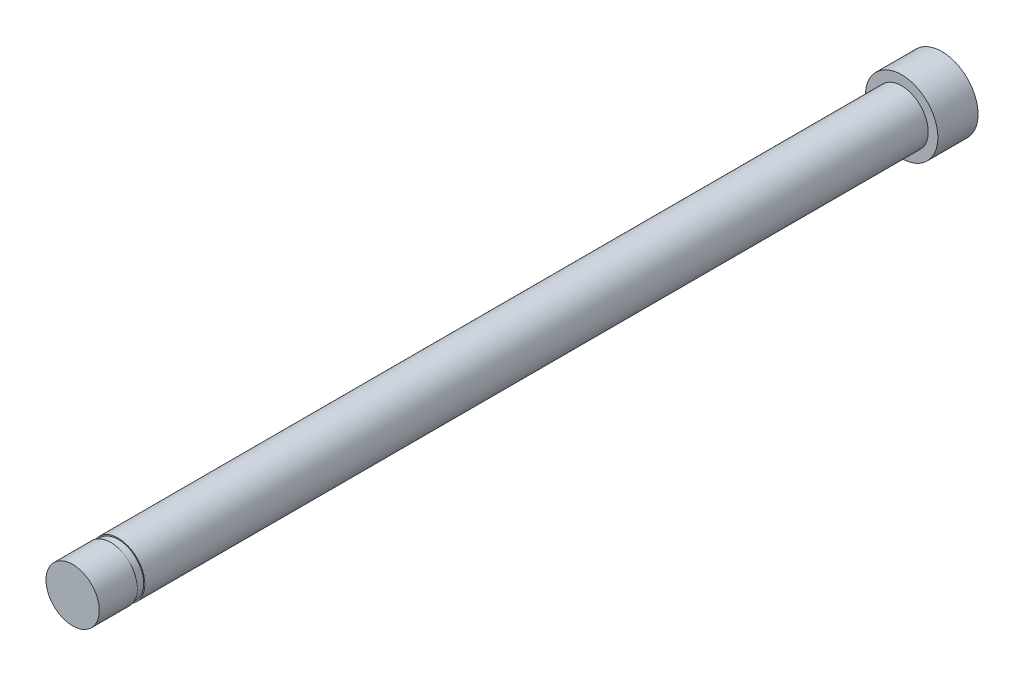
ISO-10303-21;
HEADER;
FILE_DESCRIPTION(('STEP AP214'),'2;1');
FILE_NAME('part.step','',(''),(''),'','','');
FILE_SCHEMA(('AUTOMOTIVE_DESIGN { 1 0 10303 214 1 1 1 1 }'));
ENDSEC;
DATA;
#1=APPLICATION_CONTEXT('core data for automotive mechanical design processes');
#2=APPLICATION_PROTOCOL_DEFINITION('international standard','automotive_design',2000,#1);
#3=PRODUCT_CONTEXT('',#1,'mechanical');
#4=PRODUCT('Part','Part','',(#3));
#5=PRODUCT_RELATED_PRODUCT_CATEGORY('part','',(#4));
#6=PRODUCT_DEFINITION_FORMATION('','',#4);
#7=PRODUCT_DEFINITION_CONTEXT('part definition',#1,'design');
#8=PRODUCT_DEFINITION('design','',#6,#7);
#9=PRODUCT_DEFINITION_SHAPE('','',#8);
#10=(LENGTH_UNIT() NAMED_UNIT(*) SI_UNIT(.MILLI.,.METRE.));
#11=(NAMED_UNIT(*) PLANE_ANGLE_UNIT() SI_UNIT($,.RADIAN.));
#12=(NAMED_UNIT(*) SI_UNIT($,.STERADIAN.) SOLID_ANGLE_UNIT());
#13=UNCERTAINTY_MEASURE_WITH_UNIT(LENGTH_MEASURE(1.E-05),#10,'distance_accuracy_value','');
#14=(GEOMETRIC_REPRESENTATION_CONTEXT(3) GLOBAL_UNCERTAINTY_ASSIGNED_CONTEXT((#13)) GLOBAL_UNIT_ASSIGNED_CONTEXT((#10,
#11,#12)) REPRESENTATION_CONTEXT('',''));
#15=CARTESIAN_POINT('',(0.,0.,0.));
#16=DIRECTION('',(0.,0.,1.));
#17=DIRECTION('',(1.,0.,0.));
#18=AXIS2_PLACEMENT_3D('',#15,#16,#17);
#19=CARTESIAN_POINT('',(0.,0.,40.767));
#20=DIRECTION('',(0.,0.,-1.));
#21=DIRECTION('',(-1.,0.,0.));
#22=AXIS2_PLACEMENT_3D('',#19,#20,#21);
#23=CYLINDRICAL_SURFACE('',#22,2.5);
#24=CARTESIAN_POINT('',(0.,0.,36.4980370408536));
#25=DIRECTION('',(0.,0.,1.));
#26=DIRECTION('',(1.,0.,0.));
#27=AXIS2_PLACEMENT_3D('',#24,#25,#26);
#28=CIRCLE('',#27,2.5);
#29=CARTESIAN_POINT('',(-2.5,0.,36.4980370408536));
#30=VERTEX_POINT('',#29);
#31=EDGE_CURVE('E51',#30,#30,#28,.T.);
#32=CARTESIAN_POINT('',(0.,0.,-36.9947996115403));
#33=DIRECTION('',(0.,0.,-1.));
#34=DIRECTION('',(-1.,0.,0.));
#35=AXIS2_PLACEMENT_3D('',#32,#33,#34);
#36=CIRCLE('',#35,2.5);
#37=CARTESIAN_POINT('',(-2.5,0.,-36.9947996115403));
#38=VERTEX_POINT('',#37);
#39=EDGE_CURVE('E10',#38,#38,#36,.T.);
#40=CARTESIAN_POINT('',(-2.5,0.,36.4980370408536));
#41=CARTESIAN_POINT('',(-2.5,0.,35.7324866590578));
#42=CARTESIAN_POINT('',(-2.5,0.,34.9669362772621));
#43=CARTESIAN_POINT('',(-2.5,0.,33.4358355136705));
#44=CARTESIAN_POINT('',(-2.5,0.,32.6702851318748));
#45=CARTESIAN_POINT('',(-2.5,0.,31.1391843682832));
#46=CARTESIAN_POINT('',(-2.5,0.,30.3736339864875));
#47=CARTESIAN_POINT('',(-2.5,0.,28.8425332228959));
#48=CARTESIAN_POINT('',(-2.5,0.,28.0769828411001));
#49=CARTESIAN_POINT('',(-2.5,0.,26.5458820775086));
#50=CARTESIAN_POINT('',(-2.5,0.,25.7803316957128));
#51=CARTESIAN_POINT('',(-2.5,0.,24.2492309321213));
#52=CARTESIAN_POINT('',(-2.5,0.,23.4836805503255));
#53=CARTESIAN_POINT('',(-2.5,0.,21.952579786734));
#54=CARTESIAN_POINT('',(-2.5,0.,21.1870294049382));
#55=CARTESIAN_POINT('',(-2.5,0.,19.6559286413467));
#56=CARTESIAN_POINT('',(-2.5,0.,18.8903782595509));
#57=CARTESIAN_POINT('',(-2.5,0.,17.3592774959594));
#58=CARTESIAN_POINT('',(-2.5,0.,16.5937271141636));
#59=CARTESIAN_POINT('',(-2.5,0.,15.0626263505721));
#60=CARTESIAN_POINT('',(-2.5,0.,14.2970759687763));
#61=CARTESIAN_POINT('',(-2.5,0.,12.7659752051847));
#62=CARTESIAN_POINT('',(-2.5,0.,12.000424823389));
#63=CARTESIAN_POINT('',(-2.5,0.,10.4693240597974));
#64=CARTESIAN_POINT('',(-2.5,0.,9.70377367800166));
#65=CARTESIAN_POINT('',(-2.5,0.,8.17267291441012));
#66=CARTESIAN_POINT('',(-2.5,0.,7.40712253261435));
#67=CARTESIAN_POINT('',(-2.5,0.,5.87602176902281));
#68=CARTESIAN_POINT('',(-2.5,0.,5.11047138722704));
#69=CARTESIAN_POINT('',(-2.5,0.,3.5793706236355));
#70=CARTESIAN_POINT('',(-2.5,0.,2.81382024183973));
#71=CARTESIAN_POINT('',(-2.5,0.,1.28271947824819));
#72=CARTESIAN_POINT('',(-2.5,0.,0.517169096452418));
#73=CARTESIAN_POINT('',(-2.5,0.,-1.01393166713912));
#74=CARTESIAN_POINT('',(-2.5,0.,-1.77948204893489));
#75=CARTESIAN_POINT('',(-2.5,0.,-3.31058281252643));
#76=CARTESIAN_POINT('',(-2.5,0.,-4.0761331943222));
#77=CARTESIAN_POINT('',(-2.5,0.,-5.60723395791374));
#78=CARTESIAN_POINT('',(-2.5,0.,-6.37278433970951));
#79=CARTESIAN_POINT('',(-2.5,0.,-7.90388510330105));
#80=CARTESIAN_POINT('',(-2.5,0.,-8.66943548509682));
#81=CARTESIAN_POINT('',(-2.5,0.,-10.2005362486884));
#82=CARTESIAN_POINT('',(-2.5,0.,-10.9660866304841));
#83=CARTESIAN_POINT('',(-2.5,0.,-12.4971873940757));
#84=CARTESIAN_POINT('',(-2.5,0.,-13.2627377758714));
#85=CARTESIAN_POINT('',(-2.5,0.,-14.793838539463));
#86=CARTESIAN_POINT('',(-2.5,0.,-15.5593889212588));
#87=CARTESIAN_POINT('',(-2.5,0.,-17.0904896848503));
#88=CARTESIAN_POINT('',(-2.5,0.,-17.8560400666461));
#89=CARTESIAN_POINT('',(-2.5,0.,-19.3871408302376));
#90=CARTESIAN_POINT('',(-2.5,0.,-20.1526912120334));
#91=CARTESIAN_POINT('',(-2.5,0.,-21.6837919756249));
#92=CARTESIAN_POINT('',(-2.5,0.,-22.4493423574207));
#93=CARTESIAN_POINT('',(-2.5,0.,-23.9804431210122));
#94=CARTESIAN_POINT('',(-2.5,0.,-24.745993502808));
#95=CARTESIAN_POINT('',(-2.5,0.,-26.2770942663995));
#96=CARTESIAN_POINT('',(-2.5,0.,-27.0426446481953));
#97=CARTESIAN_POINT('',(-2.5,0.,-28.5737454117868));
#98=CARTESIAN_POINT('',(-2.5,0.,-29.3392957935826));
#99=CARTESIAN_POINT('',(-2.5,0.,-30.8703965571742));
#100=CARTESIAN_POINT('',(-2.5,0.,-31.6359469389699));
#101=CARTESIAN_POINT('',(-2.5,0.,-33.1670477025615));
#102=CARTESIAN_POINT('',(-2.5,0.,-33.9325980843572));
#103=CARTESIAN_POINT('',(-2.5,0.,-35.4636988479488));
#104=CARTESIAN_POINT('',(-2.5,0.,-36.2292492297445));
#105=CARTESIAN_POINT('',(-2.5,0.,-36.9947996115403));
#106=B_SPLINE_CURVE_WITH_KNOTS('',3,(#40,#41,#42,#43,#44,#45,#46,#47,#48,#49,#50,#51,#52,#53,
#54,#55,#56,#57,#58,#59,#60,#61,#62,#63,#64,#65,#66,#67,#68,#69,#70,#71,#72,#73,#74,#75,#76,#77,
#78,#79,#80,#81,#82,#83,#84,#85,#86,#87,#88,#89,#90,#91,#92,#93,#94,#95,#96,#97,#98,#99,#100,
#101,#102,#103,#104,#105),.UNSPECIFIED.,.F.,.F.,(4,2,2,2,2,2,2,2,2,2,2,2,2,2,2,2,2,2,2,2,2,2,2,
2,2,2,2,2,2,2,2,2,4),(0.,2.29665114538731,4.59330229077462,6.88995343616193,9.18660458154924,
11.4832557269365,13.7799068723239,16.0765580177112,18.3732091630985,20.6698603084858,
22.9665114538731,25.2631625992604,27.5598137446477,29.856464890035,32.1531160354224,
34.4497671808097,36.746418326197,39.0430694715843,41.3397206169716,43.6363717623589,
45.9330229077462,48.2296740531335,50.5263251985208,52.8229763439081,55.1196274892955,
57.4162786346828,59.7129297800701,62.0095809254574,64.3062320708447,66.602883216232,
68.8995343616193,71.1961855070066,73.4928366523939),.UNSPECIFIED.);
#107=EDGE_CURVE('BSEAM31',#30,#38,#106,.T.);
#108=ORIENTED_EDGE('',*,*,#31,.F.);
#109=ORIENTED_EDGE('',*,*,#39,.F.);
#110=ORIENTED_EDGE('',*,*,#107,.T.);
#111=ORIENTED_EDGE('',*,*,#107,.F.);
#112=EDGE_LOOP('',(#108,#110,#109,#111));
#113=FACE_BOUND('',#112,.T.);
#114=ADVANCED_FACE('F31',(#113),#23,.T.);
#115=CARTESIAN_POINT('',(0.,0.,40.767));
#116=DIRECTION('',(0.,0.,1.));
#117=DIRECTION('',(1.,0.,0.));
#118=AXIS2_PLACEMENT_3D('',#115,#116,#117);
#119=CIRCLE('',#118,2.5);
#120=CARTESIAN_POINT('',(-2.5,0.,40.767));
#121=VERTEX_POINT('',#120);
#122=EDGE_CURVE('E38',#121,#121,#119,.T.);
#123=CARTESIAN_POINT('',(0.,0.,37.1980370408536));
#124=DIRECTION('',(0.,0.,1.));
#125=DIRECTION('',(1.,0.,0.));
#126=AXIS2_PLACEMENT_3D('',#123,#124,#125);
#127=CIRCLE('',#126,2.5);
#128=CARTESIAN_POINT('',(-2.5,0.,37.1980370408536));
#129=VERTEX_POINT('',#128);
#130=EDGE_CURVE('E54',#129,#129,#127,.T.);
#131=CARTESIAN_POINT('',(-2.5,0.,40.767));
#132=CARTESIAN_POINT('',(-2.5,0.,40.7298233025089));
#133=CARTESIAN_POINT('',(-2.5,0.,40.6926466050178));
#134=CARTESIAN_POINT('',(-2.5,0.,40.6182932100356));
#135=CARTESIAN_POINT('',(-2.5,0.,40.5811165125444));
#136=CARTESIAN_POINT('',(-2.5,0.,40.5067631175622));
#137=CARTESIAN_POINT('',(-2.5,0.,40.4695864200711));
#138=CARTESIAN_POINT('',(-2.5,0.,40.3952330250889));
#139=CARTESIAN_POINT('',(-2.5,0.,40.3580563275978));
#140=CARTESIAN_POINT('',(-2.5,0.,40.2837029326156));
#141=CARTESIAN_POINT('',(-2.5,0.,40.2465262351245));
#142=CARTESIAN_POINT('',(-2.5,0.,40.1721728401423));
#143=CARTESIAN_POINT('',(-2.5,0.,40.1349961426511));
#144=CARTESIAN_POINT('',(-2.5,0.,40.0606427476689));
#145=CARTESIAN_POINT('',(-2.5,0.,40.0234660501778));
#146=CARTESIAN_POINT('',(-2.5,0.,39.9491126551956));
#147=CARTESIAN_POINT('',(-2.5,0.,39.9119359577045));
#148=CARTESIAN_POINT('',(-2.5,0.,39.8375825627223));
#149=CARTESIAN_POINT('',(-2.5,0.,39.8004058652312));
#150=CARTESIAN_POINT('',(-2.5,0.,39.726052470249));
#151=CARTESIAN_POINT('',(-2.5,0.,39.6888757727578));
#152=CARTESIAN_POINT('',(-2.5,0.,39.6145223777756));
#153=CARTESIAN_POINT('',(-2.5,0.,39.5773456802845));
#154=CARTESIAN_POINT('',(-2.5,0.,39.5029922853023));
#155=CARTESIAN_POINT('',(-2.5,0.,39.4658155878112));
#156=CARTESIAN_POINT('',(-2.5,0.,39.391462192829));
#157=CARTESIAN_POINT('',(-2.5,0.,39.3542854953379));
#158=CARTESIAN_POINT('',(-2.5,0.,39.2799321003557));
#159=CARTESIAN_POINT('',(-2.5,0.,39.2427554028646));
#160=CARTESIAN_POINT('',(-2.5,0.,39.1684020078823));
#161=CARTESIAN_POINT('',(-2.5,0.,39.1312253103912));
#162=CARTESIAN_POINT('',(-2.5,0.,39.056871915409));
#163=CARTESIAN_POINT('',(-2.5,0.,39.0196952179179));
#164=CARTESIAN_POINT('',(-2.5,0.,38.9453418229357));
#165=CARTESIAN_POINT('',(-2.5,0.,38.9081651254446));
#166=CARTESIAN_POINT('',(-2.5,0.,38.8338117304624));
#167=CARTESIAN_POINT('',(-2.5,0.,38.7966350329713));
#168=CARTESIAN_POINT('',(-2.5,0.,38.722281637989));
#169=CARTESIAN_POINT('',(-2.5,0.,38.6851049404979));
#170=CARTESIAN_POINT('',(-2.5,0.,38.6107515455157));
#171=CARTESIAN_POINT('',(-2.5,0.,38.5735748480246));
#172=CARTESIAN_POINT('',(-2.5,0.,38.4992214530424));
#173=CARTESIAN_POINT('',(-2.5,0.,38.4620447555513));
#174=CARTESIAN_POINT('',(-2.5,0.,38.3876913605691));
#175=CARTESIAN_POINT('',(-2.5,0.,38.350514663078));
#176=CARTESIAN_POINT('',(-2.5,0.,38.2761612680958));
#177=CARTESIAN_POINT('',(-2.5,0.,38.2389845706046));
#178=CARTESIAN_POINT('',(-2.5,0.,38.1646311756224));
#179=CARTESIAN_POINT('',(-2.5,0.,38.1274544781313));
#180=CARTESIAN_POINT('',(-2.5,0.,38.0531010831491));
#181=CARTESIAN_POINT('',(-2.5,0.,38.015924385658));
#182=CARTESIAN_POINT('',(-2.5,0.,37.9415709906758));
#183=CARTESIAN_POINT('',(-2.5,0.,37.9043942931847));
#184=CARTESIAN_POINT('',(-2.5,0.,37.8300408982025));
#185=CARTESIAN_POINT('',(-2.5,0.,37.7928642007113));
#186=CARTESIAN_POINT('',(-2.5,0.,37.7185108057291));
#187=CARTESIAN_POINT('',(-2.5,0.,37.681334108238));
#188=CARTESIAN_POINT('',(-2.5,0.,37.6069807132558));
#189=CARTESIAN_POINT('',(-2.5,0.,37.5698040157647));
#190=CARTESIAN_POINT('',(-2.5,0.,37.4954506207825));
#191=CARTESIAN_POINT('',(-2.5,0.,37.4582739232914));
#192=CARTESIAN_POINT('',(-2.5,0.,37.3839205283092));
#193=CARTESIAN_POINT('',(-2.5,0.,37.3467438308181));
#194=CARTESIAN_POINT('',(-2.5,0.,37.2723904358358));
#195=CARTESIAN_POINT('',(-2.5,0.,37.2352137383447));
#196=CARTESIAN_POINT('',(-2.5,0.,37.1980370408536));
#197=B_SPLINE_CURVE_WITH_KNOTS('',3,(#131,#132,#133,#134,#135,#136,#137,#138,#139,#140,#141,
#142,#143,#144,#145,#146,#147,#148,#149,#150,#151,#152,#153,#154,#155,#156,#157,#158,#159,#160,
#161,#162,#163,#164,#165,#166,#167,#168,#169,#170,#171,#172,#173,#174,#175,#176,#177,#178,#179,
#180,#181,#182,#183,#184,#185,#186,#187,#188,#189,#190,#191,#192,#193,#194,#195,#196),
.UNSPECIFIED.,.F.,.F.,(4,2,2,2,2,2,2,2,2,2,2,2,2,2,2,2,2,2,2,2,2,2,2,2,2,2,2,2,2,2,2,2,4),(0.,
0.111530092473319,0.223060184946645,0.334590277419965,0.446120369893291,0.557650462366617,
0.669180554839936,0.780710647313262,0.892240739786589,1.00377083225991,1.11530092473323,
1.22683101720655,1.33836110967988,1.44989120215321,1.56142129462652,1.67295138709985,
1.78448147957318,1.8960115720465,2.00754166451982,2.11907175699314,2.23060184946647,
2.34213194193979,2.45366203441311,2.56519212688644,2.67672221935977,2.78825231183309,
2.89978240430641,3.01131249677973,3.12284258925306,3.23437268172638,3.3459027741997,
3.45743286667303,3.56896295914635),.UNSPECIFIED.);
#198=EDGE_CURVE('BSEAM33',#121,#129,#197,.T.);
#199=ORIENTED_EDGE('',*,*,#122,.F.);
#200=ORIENTED_EDGE('',*,*,#130,.T.);
#201=ORIENTED_EDGE('',*,*,#198,.T.);
#202=ORIENTED_EDGE('',*,*,#198,.F.);
#203=EDGE_LOOP('',(#199,#201,#200,#202));
#204=FACE_BOUND('',#203,.T.);
#205=ADVANCED_FACE('F33',(#204),#23,.T.);
#206=CARTESIAN_POINT('',(0.,0.,40.767));
#207=DIRECTION('',(0.,0.,1.));
#208=DIRECTION('',(1.,0.,0.));
#209=AXIS2_PLACEMENT_3D('',#206,#207,#208);
#210=PLANE('',#209);
#211=ORIENTED_EDGE('',*,*,#122,.T.);
#212=EDGE_LOOP('',(#211));
#213=FACE_BOUND('',#212,.T.);
#214=ADVANCED_FACE('F87',(#213),#210,.T.);
#215=CARTESIAN_POINT('',(0.,2.5,37.1980370408536));
#216=DIRECTION('',(0.,0.,-1.));
#217=DIRECTION('',(-1.,0.,0.));
#218=AXIS2_PLACEMENT_3D('',#215,#216,#217);
#219=PLANE('',#218);
#220=CARTESIAN_POINT('',(0.,0.,37.1980370408536));
#221=DIRECTION('',(0.,0.,1.));
#222=DIRECTION('',(1.,0.,0.));
#223=AXIS2_PLACEMENT_3D('',#220,#221,#222);
#224=CIRCLE('',#223,2.4);
#225=CARTESIAN_POINT('',(2.4,0.,37.1980370408536));
#226=VERTEX_POINT('',#225);
#227=EDGE_CURVE('E42',#226,#226,#224,.T.);
#228=ORIENTED_EDGE('',*,*,#227,.T.);
#229=EDGE_LOOP('',(#228));
#230=FACE_BOUND('',#229,.T.);
#231=ORIENTED_EDGE('',*,*,#130,.F.);
#232=EDGE_LOOP('',(#231));
#233=FACE_BOUND('',#232,.T.);
#234=ADVANCED_FACE('F96',(#230,#233),#219,.T.);
#235=CARTESIAN_POINT('',(0.,0.,40.767));
#236=DIRECTION('',(0.,0.,1.));
#237=DIRECTION('',(1.,0.,0.));
#238=AXIS2_PLACEMENT_3D('',#235,#236,#237);
#239=CYLINDRICAL_SURFACE('',#238,2.4);
#240=CARTESIAN_POINT('',(0.,0.,36.4980370408536));
#241=DIRECTION('',(0.,0.,1.));
#242=DIRECTION('',(1.,0.,0.));
#243=AXIS2_PLACEMENT_3D('',#240,#241,#242);
#244=CIRCLE('',#243,2.4);
#245=CARTESIAN_POINT('',(2.4,0.,36.4980370408536));
#246=VERTEX_POINT('',#245);
#247=EDGE_CURVE('E46',#246,#246,#244,.T.);
#248=ORIENTED_EDGE('',*,*,#247,.T.);
#249=EDGE_LOOP('',(#248));
#250=FACE_BOUND('',#249,.T.);
#251=ORIENTED_EDGE('',*,*,#227,.F.);
#252=EDGE_LOOP('',(#251));
#253=FACE_BOUND('',#252,.T.);
#254=ADVANCED_FACE('F77',(#250,#253),#239,.T.);
#255=CARTESIAN_POINT('',(0.,2.5,36.4980370408536));
#256=DIRECTION('',(0.,0.,1.));
#257=DIRECTION('',(1.,0.,0.));
#258=AXIS2_PLACEMENT_3D('',#255,#256,#257);
#259=PLANE('',#258);
#260=ORIENTED_EDGE('',*,*,#31,.T.);
#261=EDGE_LOOP('',(#260));
#262=FACE_BOUND('',#261,.T.);
#263=ORIENTED_EDGE('',*,*,#247,.F.);
#264=EDGE_LOOP('',(#263));
#265=FACE_BOUND('',#264,.T.);
#266=ADVANCED_FACE('F69',(#262,#265),#259,.T.);
#267=CARTESIAN_POINT('',(0.,0.,-27.3718521643307));
#268=DIRECTION('',(0.,0.,-1.));
#269=DIRECTION('',(-1.,0.,0.));
#270=AXIS2_PLACEMENT_3D('',#267,#268,#269);
#271=CYLINDRICAL_SURFACE('',#270,3.40222569746185);
#272=CARTESIAN_POINT('',(0.,0.,-36.9947996115403));
#273=DIRECTION('',(0.,0.,-1.));
#274=DIRECTION('',(-1.,0.,0.));
#275=AXIS2_PLACEMENT_3D('',#272,#273,#274);
#276=CIRCLE('',#275,3.40222569746185);
#277=CARTESIAN_POINT('',(-3.40222569746185,0.,-36.9947996115403));
#278=VERTEX_POINT('',#277);
#279=EDGE_CURVE('E57',#278,#278,#276,.F.);
#280=CARTESIAN_POINT('',(0.,0.,-40.767));
#281=DIRECTION('',(0.,0.,-1.));
#282=DIRECTION('',(-1.,0.,0.));
#283=AXIS2_PLACEMENT_3D('',#280,#281,#282);
#284=CIRCLE('',#283,3.40222569746185);
#285=CARTESIAN_POINT('',(-3.40222569746185,0.,-40.767));
#286=VERTEX_POINT('',#285);
#287=EDGE_CURVE('E60',#286,#286,#284,.T.);
#288=CARTESIAN_POINT('',(-3.40222569746185,0.,-36.9947996115403));
#289=CARTESIAN_POINT('',(-3.40222569746185,0.,-37.0340933655868));
#290=CARTESIAN_POINT('',(-3.40222569746185,0.,-37.0733871196332));
#291=CARTESIAN_POINT('',(-3.40222569746185,0.,-37.1519746277261));
#292=CARTESIAN_POINT('',(-3.40222569746185,0.,-37.1912683817726));
#293=CARTESIAN_POINT('',(-3.40222569746185,0.,-37.2698558898655));
#294=CARTESIAN_POINT('',(-3.40222569746185,0.,-37.309149643912));
#295=CARTESIAN_POINT('',(-3.40222569746185,0.,-37.3877371520049));
#296=CARTESIAN_POINT('',(-3.40222569746185,0.,-37.4270309060513));
#297=CARTESIAN_POINT('',(-3.40222569746185,0.,-37.5056184141442));
#298=CARTESIAN_POINT('',(-3.40222569746185,0.,-37.5449121681907));
#299=CARTESIAN_POINT('',(-3.40222569746185,0.,-37.6234996762836));
#300=CARTESIAN_POINT('',(-3.40222569746185,0.,-37.66279343033));
#301=CARTESIAN_POINT('',(-3.40222569746185,0.,-37.7413809384229));
#302=CARTESIAN_POINT('',(-3.40222569746185,0.,-37.7806746924694));
#303=CARTESIAN_POINT('',(-3.40222569746185,0.,-37.8592622005623));
#304=CARTESIAN_POINT('',(-3.40222569746185,0.,-37.8985559546088));
#305=CARTESIAN_POINT('',(-3.40222569746185,0.,-37.9771434627017));
#306=CARTESIAN_POINT('',(-3.40222569746185,0.,-38.0164372167481));
#307=CARTESIAN_POINT('',(-3.40222569746185,0.,-38.095024724841));
#308=CARTESIAN_POINT('',(-3.40222569746185,0.,-38.1343184788875));
#309=CARTESIAN_POINT('',(-3.40222569746185,0.,-38.2129059869804));
#310=CARTESIAN_POINT('',(-3.40222569746185,0.,-38.2521997410269));
#311=CARTESIAN_POINT('',(-3.40222569746185,0.,-38.3307872491198));
#312=CARTESIAN_POINT('',(-3.40222569746185,0.,-38.3700810031662));
#313=CARTESIAN_POINT('',(-3.40222569746185,0.,-38.4486685112591));
#314=CARTESIAN_POINT('',(-3.40222569746185,0.,-38.4879622653056));
#315=CARTESIAN_POINT('',(-3.40222569746185,0.,-38.5665497733985));
#316=CARTESIAN_POINT('',(-3.40222569746185,0.,-38.605843527445));
#317=CARTESIAN_POINT('',(-3.40222569746185,0.,-38.6844310355379));
#318=CARTESIAN_POINT('',(-3.40222569746185,0.,-38.7237247895843));
#319=CARTESIAN_POINT('',(-3.40222569746185,0.,-38.8023122976772));
#320=CARTESIAN_POINT('',(-3.40222569746185,0.,-38.8416060517237));
#321=CARTESIAN_POINT('',(-3.40222569746185,0.,-38.9201935598166));
#322=CARTESIAN_POINT('',(-3.40222569746185,0.,-38.9594873138631));
#323=CARTESIAN_POINT('',(-3.40222569746185,0.,-39.038074821956));
#324=CARTESIAN_POINT('',(-3.40222569746185,0.,-39.0773685760024));
#325=CARTESIAN_POINT('',(-3.40222569746185,0.,-39.1559560840953));
#326=CARTESIAN_POINT('',(-3.40222569746185,0.,-39.1952498381418));
#327=CARTESIAN_POINT('',(-3.40222569746185,0.,-39.2738373462347));
#328=CARTESIAN_POINT('',(-3.40222569746185,0.,-39.3131311002812));
#329=CARTESIAN_POINT('',(-3.40222569746185,0.,-39.3917186083741));
#330=CARTESIAN_POINT('',(-3.40222569746185,0.,-39.4310123624205));
#331=CARTESIAN_POINT('',(-3.40222569746185,0.,-39.5095998705134));
#332=CARTESIAN_POINT('',(-3.40222569746185,0.,-39.5488936245599));
#333=CARTESIAN_POINT('',(-3.40222569746185,0.,-39.6274811326528));
#334=CARTESIAN_POINT('',(-3.40222569746185,0.,-39.6667748866992));
#335=CARTESIAN_POINT('',(-3.40222569746185,0.,-39.7453623947922));
#336=CARTESIAN_POINT('',(-3.40222569746185,0.,-39.7846561488386));
#337=CARTESIAN_POINT('',(-3.40222569746185,0.,-39.8632436569315));
#338=CARTESIAN_POINT('',(-3.40222569746185,0.,-39.902537410978));
#339=CARTESIAN_POINT('',(-3.40222569746185,0.,-39.9811249190709));
#340=CARTESIAN_POINT('',(-3.40222569746185,0.,-40.0204186731173));
#341=CARTESIAN_POINT('',(-3.40222569746185,0.,-40.0990061812102));
#342=CARTESIAN_POINT('',(-3.40222569746185,0.,-40.1382999352567));
#343=CARTESIAN_POINT('',(-3.40222569746185,0.,-40.2168874433496));
#344=CARTESIAN_POINT('',(-3.40222569746185,0.,-40.2561811973961));
#345=CARTESIAN_POINT('',(-3.40222569746185,0.,-40.334768705489));
#346=CARTESIAN_POINT('',(-3.40222569746185,0.,-40.3740624595354));
#347=CARTESIAN_POINT('',(-3.40222569746185,0.,-40.4526499676283));
#348=CARTESIAN_POINT('',(-3.40222569746185,0.,-40.4919437216748));
#349=CARTESIAN_POINT('',(-3.40222569746185,0.,-40.5705312297677));
#350=CARTESIAN_POINT('',(-3.40222569746185,0.,-40.6098249838142));
#351=CARTESIAN_POINT('',(-3.40222569746185,0.,-40.6884124919071));
#352=CARTESIAN_POINT('',(-3.40222569746185,0.,-40.7277062459535));
#353=CARTESIAN_POINT('',(-3.40222569746185,0.,-40.767));
#354=B_SPLINE_CURVE_WITH_KNOTS('',3,(#288,#289,#290,#291,#292,#293,#294,#295,#296,#297,#298,
#299,#300,#301,#302,#303,#304,#305,#306,#307,#308,#309,#310,#311,#312,#313,#314,#315,#316,#317,
#318,#319,#320,#321,#322,#323,#324,#325,#326,#327,#328,#329,#330,#331,#332,#333,#334,#335,#336,
#337,#338,#339,#340,#341,#342,#343,#344,#345,#346,#347,#348,#349,#350,#351,#352,#353),
.UNSPECIFIED.,.F.,.F.,(4,2,2,2,2,2,2,2,2,2,2,2,2,2,2,2,2,2,2,2,2,2,2,2,2,2,2,2,2,2,2,2,4),(0.,
0.117881262139366,0.235762524278732,0.353643786418098,0.471525048557457,0.589406310696823,
0.707287572836189,0.825168834975555,0.943050097114921,1.06093135925429,1.17881262139365,
1.29669388353301,1.41457514567238,1.53245640781174,1.65033766995111,1.76821893209047,
1.88610019422984,2.0039814563692,2.12186271850857,2.23974398064793,2.3576252427873,
2.47550650492666,2.59338776706602,2.71126902920539,2.82915029134476,2.94703155348412,
3.06491281562348,3.18279407776285,3.30067533990221,3.41855660204158,3.53643786418095,
3.65431912632031,3.77220038845967),.UNSPECIFIED.);
#355=EDGE_CURVE('BSEAM66',#278,#286,#354,.T.);
#356=ORIENTED_EDGE('',*,*,#279,.F.);
#357=ORIENTED_EDGE('',*,*,#287,.F.);
#358=ORIENTED_EDGE('',*,*,#355,.T.);
#359=ORIENTED_EDGE('',*,*,#355,.F.);
#360=EDGE_LOOP('',(#356,#358,#357,#359));
#361=FACE_BOUND('',#360,.T.);
#362=ADVANCED_FACE('F66',(#361),#271,.T.);
#363=CARTESIAN_POINT('',(0.,0.,-36.9947996115403));
#364=DIRECTION('',(0.,0.,-1.));
#365=DIRECTION('',(0.576014356159003,-0.81743957666529,0.));
#366=AXIS2_PLACEMENT_3D('',#363,#364,#365);
#367=PLANE('',#366);
#368=ORIENTED_EDGE('',*,*,#39,.T.);
#369=EDGE_LOOP('',(#368));
#370=FACE_BOUND('',#369,.T.);
#371=ORIENTED_EDGE('',*,*,#279,.T.);
#372=EDGE_LOOP('',(#371));
#373=FACE_BOUND('',#372,.T.);
#374=ADVANCED_FACE('F68',(#370,#373),#367,.F.);
#375=CARTESIAN_POINT('',(0.,0.,-40.767));
#376=DIRECTION('',(0.,0.,1.));
#377=DIRECTION('',(1.,0.,0.));
#378=AXIS2_PLACEMENT_3D('',#375,#376,#377);
#379=PLANE('',#378);
#380=ORIENTED_EDGE('',*,*,#287,.T.);
#381=EDGE_LOOP('',(#380));
#382=FACE_BOUND('',#381,.T.);
#383=ADVANCED_FACE('F64',(#382),#379,.F.);
#384=CLOSED_SHELL('',(#114,#205,#214,#234,#254,#266,#362,#374,#383));
#385=MANIFOLD_SOLID_BREP('B2',#384);
#386=ADVANCED_BREP_SHAPE_REPRESENTATION('',(#18,#385),#14);
#387=SHAPE_DEFINITION_REPRESENTATION(#9,#386);
ENDSEC;
END-ISO-10303-21;
